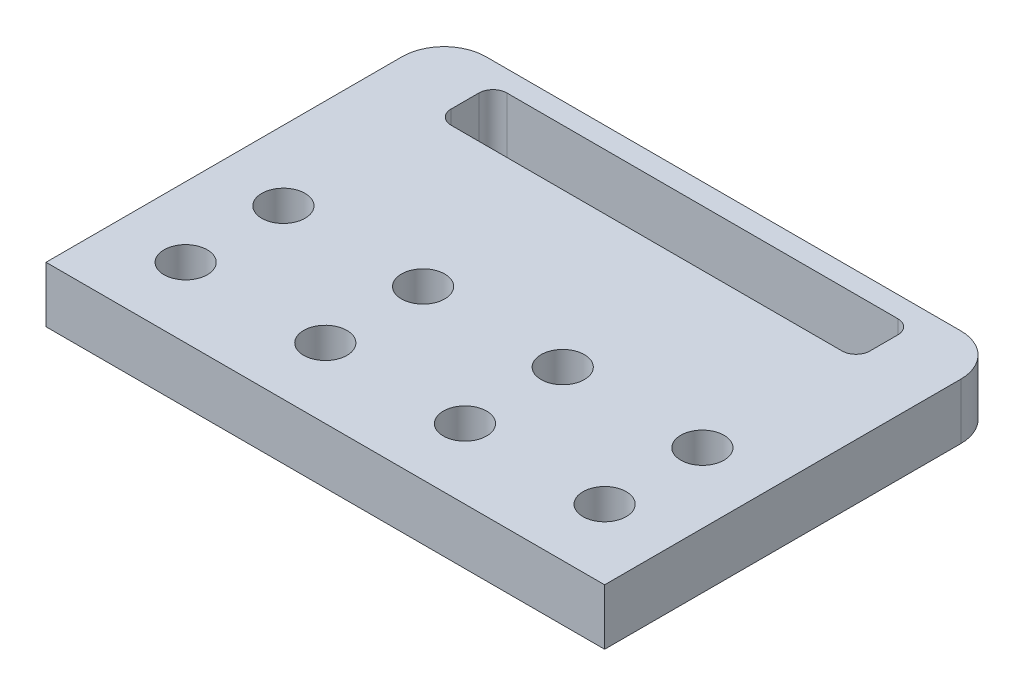
ISO-10303-21;
HEADER;
FILE_DESCRIPTION(('STEP AP214'),'2;1');
FILE_NAME('part.step','',(''),(''),'','','');
FILE_SCHEMA(('AUTOMOTIVE_DESIGN { 1 0 10303 214 1 1 1 1 }'));
ENDSEC;
DATA;
#1=APPLICATION_CONTEXT('core data for automotive mechanical design processes');
#2=APPLICATION_PROTOCOL_DEFINITION('international standard','automotive_design',2000,#1);
#3=PRODUCT_CONTEXT('',#1,'mechanical');
#4=PRODUCT('Part','Part','',(#3));
#5=PRODUCT_RELATED_PRODUCT_CATEGORY('part','',(#4));
#6=PRODUCT_DEFINITION_FORMATION('','',#4);
#7=PRODUCT_DEFINITION_CONTEXT('part definition',#1,'design');
#8=PRODUCT_DEFINITION('design','',#6,#7);
#9=PRODUCT_DEFINITION_SHAPE('','',#8);
#10=(LENGTH_UNIT() NAMED_UNIT(*) SI_UNIT(.MILLI.,.METRE.));
#11=(NAMED_UNIT(*) PLANE_ANGLE_UNIT() SI_UNIT($,.RADIAN.));
#12=(NAMED_UNIT(*) SI_UNIT($,.STERADIAN.) SOLID_ANGLE_UNIT());
#13=UNCERTAINTY_MEASURE_WITH_UNIT(LENGTH_MEASURE(1.E-05),#10,'distance_accuracy_value','');
#14=(GEOMETRIC_REPRESENTATION_CONTEXT(3) GLOBAL_UNCERTAINTY_ASSIGNED_CONTEXT((#13)) GLOBAL_UNIT_ASSIGNED_CONTEXT((#10,
#11,#12)) REPRESENTATION_CONTEXT('',''));
#15=CARTESIAN_POINT('',(0.,0.,0.));
#16=DIRECTION('',(0.,0.,1.));
#17=DIRECTION('',(1.,0.,0.));
#18=AXIS2_PLACEMENT_3D('',#15,#16,#17);
#19=CARTESIAN_POINT('',(0.,4.,0.));
#20=DIRECTION('',(0.,-1.,0.));
#21=DIRECTION('',(0.,0.,-1.));
#22=AXIS2_PLACEMENT_3D('',#19,#20,#21);
#23=PLANE('',#22);
#24=CARTESIAN_POINT('',(-15.,4.,2.25));
#25=DIRECTION('',(0.,1.,0.));
#26=DIRECTION('',(0.,0.,1.));
#27=AXIS2_PLACEMENT_3D('',#24,#25,#26);
#28=CIRCLE('',#27,1.55);
#29=CARTESIAN_POINT('',(-15.,4.,3.8));
#30=VERTEX_POINT('',#29);
#31=EDGE_CURVE('E598',#30,#30,#28,.T.);
#32=ORIENTED_EDGE('',*,*,#31,.F.);
#33=EDGE_LOOP('',(#32));
#34=FACE_BOUND('',#33,.T.);
#35=CARTESIAN_POINT('',(-5.,4.,2.25));
#36=DIRECTION('',(0.,1.,0.));
#37=DIRECTION('',(0.,0.,1.));
#38=AXIS2_PLACEMENT_3D('',#35,#36,#37);
#39=CIRCLE('',#38,1.55);
#40=CARTESIAN_POINT('',(-5.,4.,3.8));
#41=VERTEX_POINT('',#40);
#42=EDGE_CURVE('E599',#41,#41,#39,.T.);
#43=ORIENTED_EDGE('',*,*,#42,.F.);
#44=EDGE_LOOP('',(#43));
#45=FACE_BOUND('',#44,.T.);
#46=CARTESIAN_POINT('',(5.,4.,2.25));
#47=DIRECTION('',(0.,1.,0.));
#48=DIRECTION('',(0.,0.,1.));
#49=AXIS2_PLACEMENT_3D('',#46,#47,#48);
#50=CIRCLE('',#49,1.55);
#51=CARTESIAN_POINT('',(5.,4.,3.8));
#52=VERTEX_POINT('',#51);
#53=EDGE_CURVE('E609',#52,#52,#50,.T.);
#54=ORIENTED_EDGE('',*,*,#53,.F.);
#55=EDGE_LOOP('',(#54));
#56=FACE_BOUND('',#55,.T.);
#57=CARTESIAN_POINT('',(15.,4.,2.25));
#58=DIRECTION('',(0.,1.,0.));
#59=DIRECTION('',(0.,0.,1.));
#60=AXIS2_PLACEMENT_3D('',#57,#58,#59);
#61=CIRCLE('',#60,1.55);
#62=CARTESIAN_POINT('',(15.,4.,3.8));
#63=VERTEX_POINT('',#62);
#64=EDGE_CURVE('E615',#63,#63,#61,.T.);
#65=ORIENTED_EDGE('',*,*,#64,.F.);
#66=EDGE_LOOP('',(#65));
#67=FACE_BOUND('',#66,.T.);
#68=CARTESIAN_POINT('',(-15.,4.,9.25000000000001));
#69=DIRECTION('',(0.,1.,0.));
#70=DIRECTION('',(0.,0.,1.));
#71=AXIS2_PLACEMENT_3D('',#68,#69,#70);
#72=CIRCLE('',#71,1.55);
#73=CARTESIAN_POINT('',(-15.,4.,10.8));
#74=VERTEX_POINT('',#73);
#75=EDGE_CURVE('E623',#74,#74,#72,.T.);
#76=ORIENTED_EDGE('',*,*,#75,.F.);
#77=EDGE_LOOP('',(#76));
#78=FACE_BOUND('',#77,.T.);
#79=CARTESIAN_POINT('',(5.,4.,9.25000000000001));
#80=DIRECTION('',(0.,1.,0.));
#81=DIRECTION('',(0.,0.,1.));
#82=AXIS2_PLACEMENT_3D('',#79,#80,#81);
#83=CIRCLE('',#82,1.55);
#84=CARTESIAN_POINT('',(5.,4.,10.8));
#85=VERTEX_POINT('',#84);
#86=EDGE_CURVE('E626',#85,#85,#83,.T.);
#87=ORIENTED_EDGE('',*,*,#86,.F.);
#88=EDGE_LOOP('',(#87));
#89=FACE_BOUND('',#88,.T.);
#90=CARTESIAN_POINT('',(15.,4.,9.25000000000001));
#91=DIRECTION('',(0.,1.,0.));
#92=DIRECTION('',(0.,0.,-1.));
#93=AXIS2_PLACEMENT_3D('',#90,#91,#92);
#94=CIRCLE('',#93,1.55);
#95=CARTESIAN_POINT('',(15.,4.,7.70000000000001));
#96=VERTEX_POINT('',#95);
#97=EDGE_CURVE('E632',#96,#96,#94,.T.);
#98=ORIENTED_EDGE('',*,*,#97,.F.);
#99=EDGE_LOOP('',(#98));
#100=FACE_BOUND('',#99,.T.);
#101=CARTESIAN_POINT('',(-5.,4.,9.25000000000001));
#102=DIRECTION('',(0.,1.,0.));
#103=DIRECTION('',(0.,0.,-1.));
#104=AXIS2_PLACEMENT_3D('',#101,#102,#103);
#105=CIRCLE('',#104,1.55000000000001);
#106=CARTESIAN_POINT('',(-5.,4.,7.7));
#107=VERTEX_POINT('',#106);
#108=EDGE_CURVE('E638',#107,#107,#105,.T.);
#109=ORIENTED_EDGE('',*,*,#108,.F.);
#110=EDGE_LOOP('',(#109));
#111=FACE_BOUND('',#110,.T.);
#112=DIRECTION('',(0.,0.,-1.));
#113=VECTOR('',#112,1.);
#114=CARTESIAN_POINT('',(20.,4.,14.25));
#115=LINE('',#114,#113);
#116=CARTESIAN_POINT('',(20.,4.,14.25));
#117=VERTEX_POINT('',#116);
#118=CARTESIAN_POINT('',(20.,4.,-11.25));
#119=VERTEX_POINT('',#118);
#120=EDGE_CURVE('E218',#117,#119,#115,.T.);
#121=ORIENTED_EDGE('',*,*,#120,.T.);
#122=CARTESIAN_POINT('',(17.,4.,-11.25));
#123=DIRECTION('',(0.,-1.,0.));
#124=DIRECTION('',(0.,0.,-1.));
#125=AXIS2_PLACEMENT_3D('',#122,#123,#124);
#126=CIRCLE('',#125,3.);
#127=CARTESIAN_POINT('',(17.,4.,-14.25));
#128=VERTEX_POINT('',#127);
#129=EDGE_CURVE('E49',#119,#128,#126,.F.);
#130=ORIENTED_EDGE('',*,*,#129,.T.);
#131=DIRECTION('',(-1.,0.,0.));
#132=VECTOR('',#131,1.);
#133=CARTESIAN_POINT('',(-20.,4.,-14.25));
#134=LINE('',#133,#132);
#135=CARTESIAN_POINT('',(-17.,4.,-14.25));
#136=VERTEX_POINT('',#135);
#137=EDGE_CURVE('E220',#128,#136,#134,.T.);
#138=ORIENTED_EDGE('',*,*,#137,.T.);
#139=CARTESIAN_POINT('',(-17.,4.,-11.25));
#140=DIRECTION('',(0.,-1.,0.));
#141=DIRECTION('',(0.,0.,-1.));
#142=AXIS2_PLACEMENT_3D('',#139,#140,#141);
#143=CIRCLE('',#142,3.);
#144=CARTESIAN_POINT('',(-20.,4.,-11.25));
#145=VERTEX_POINT('',#144);
#146=EDGE_CURVE('E56',#136,#145,#143,.F.);
#147=ORIENTED_EDGE('',*,*,#146,.T.);
#148=DIRECTION('',(0.,0.,1.));
#149=VECTOR('',#148,1.);
#150=CARTESIAN_POINT('',(-20.,4.,14.25));
#151=LINE('',#150,#149);
#152=CARTESIAN_POINT('',(-20.,4.,14.25));
#153=VERTEX_POINT('',#152);
#154=EDGE_CURVE('E223',#145,#153,#151,.T.);
#155=ORIENTED_EDGE('',*,*,#154,.T.);
#156=DIRECTION('',(1.,0.,0.));
#157=VECTOR('',#156,1.);
#158=CARTESIAN_POINT('',(-20.,4.,14.25));
#159=LINE('',#158,#157);
#160=EDGE_CURVE('E225',#153,#117,#159,.T.);
#161=ORIENTED_EDGE('',*,*,#160,.T.);
#162=EDGE_LOOP('',(#121,#130,#138,#147,#155,#161));
#163=FACE_BOUND('',#162,.T.);
#164=CARTESIAN_POINT('',(14.,4.,-11.75));
#165=DIRECTION('',(0.,1.,0.));
#166=DIRECTION('',(0.,0.,-1.));
#167=AXIS2_PLACEMENT_3D('',#164,#165,#166);
#168=CIRCLE('',#167,0.999999999999999);
#169=CARTESIAN_POINT('',(15.,4.,-11.75));
#170=VERTEX_POINT('',#169);
#171=CARTESIAN_POINT('',(14.,4.,-12.75));
#172=VERTEX_POINT('',#171);
#173=EDGE_CURVE('E146',#170,#172,#168,.T.);
#174=ORIENTED_EDGE('',*,*,#173,.F.);
#175=DIRECTION('',(0.,0.,-1.));
#176=VECTOR('',#175,1.);
#177=CARTESIAN_POINT('',(15.,4.,-11.75));
#178=LINE('',#177,#176);
#179=CARTESIAN_POINT('',(15.,4.,-9.74999999999999));
#180=VERTEX_POINT('',#179);
#181=EDGE_CURVE('E183',#180,#170,#178,.T.);
#182=ORIENTED_EDGE('',*,*,#181,.F.);
#183=CARTESIAN_POINT('',(14.,4.,-9.74999999999999));
#184=DIRECTION('',(0.,1.,0.));
#185=DIRECTION('',(0.,0.,1.));
#186=AXIS2_PLACEMENT_3D('',#183,#184,#185);
#187=CIRCLE('',#186,0.999999999999999);
#188=CARTESIAN_POINT('',(14.,4.,-8.74999999999999));
#189=VERTEX_POINT('',#188);
#190=EDGE_CURVE('E180',#189,#180,#187,.T.);
#191=ORIENTED_EDGE('',*,*,#190,.F.);
#192=DIRECTION('',(1.,0.,0.));
#193=VECTOR('',#192,1.);
#194=CARTESIAN_POINT('',(-14.,4.,-8.74999999999999));
#195=LINE('',#194,#193);
#196=CARTESIAN_POINT('',(-14.,4.,-8.75));
#197=VERTEX_POINT('',#196);
#198=EDGE_CURVE('E178',#197,#189,#195,.T.);
#199=ORIENTED_EDGE('',*,*,#198,.F.);
#200=CARTESIAN_POINT('',(-14.,4.,-9.74999999999999));
#201=DIRECTION('',(0.,1.,0.));
#202=DIRECTION('',(0.,0.,1.));
#203=AXIS2_PLACEMENT_3D('',#200,#201,#202);
#204=CIRCLE('',#203,0.999999999999999);
#205=CARTESIAN_POINT('',(-15.,4.,-9.74999999999999));
#206=VERTEX_POINT('',#205);
#207=EDGE_CURVE('E176',#206,#197,#204,.T.);
#208=ORIENTED_EDGE('',*,*,#207,.F.);
#209=DIRECTION('',(0.,0.,1.));
#210=VECTOR('',#209,1.);
#211=CARTESIAN_POINT('',(-15.,4.,-11.75));
#212=LINE('',#211,#210);
#213=CARTESIAN_POINT('',(-15.,4.,-11.75));
#214=VERTEX_POINT('',#213);
#215=EDGE_CURVE('E171',#214,#206,#212,.T.);
#216=ORIENTED_EDGE('',*,*,#215,.F.);
#217=CARTESIAN_POINT('',(-14.,4.,-11.75));
#218=DIRECTION('',(0.,1.,0.));
#219=DIRECTION('',(0.,0.,1.));
#220=AXIS2_PLACEMENT_3D('',#217,#218,#219);
#221=CIRCLE('',#220,0.999999999999999);
#222=CARTESIAN_POINT('',(-14.,4.,-12.75));
#223=VERTEX_POINT('',#222);
#224=EDGE_CURVE('E169',#223,#214,#221,.T.);
#225=ORIENTED_EDGE('',*,*,#224,.F.);
#226=DIRECTION('',(-1.,0.,0.));
#227=VECTOR('',#226,1.);
#228=CARTESIAN_POINT('',(-14.,4.,-12.75));
#229=LINE('',#228,#227);
#230=EDGE_CURVE('E156',#172,#223,#229,.T.);
#231=ORIENTED_EDGE('',*,*,#230,.F.);
#232=EDGE_LOOP('',(#174,#182,#191,#199,#208,#216,#225,#231));
#233=FACE_BOUND('',#232,.T.);
#234=ADVANCED_FACE('F41',(#34,#45,#56,#67,#78,#89,#100,#111,#163,#233),#23,.F.);
#235=CARTESIAN_POINT('',(0.,0.,0.));
#236=DIRECTION('',(0.,-1.,0.));
#237=DIRECTION('',(0.,0.,-1.));
#238=AXIS2_PLACEMENT_3D('',#235,#236,#237);
#239=PLANE('',#238);
#240=CARTESIAN_POINT('',(-15.,0.,2.25));
#241=DIRECTION('',(0.,1.,0.));
#242=DIRECTION('',(0.,0.,1.));
#243=AXIS2_PLACEMENT_3D('',#240,#241,#242);
#244=CIRCLE('',#243,1.55);
#245=CARTESIAN_POINT('',(-15.,0.,3.8));
#246=VERTEX_POINT('',#245);
#247=EDGE_CURVE('E596',#246,#246,#244,.T.);
#248=ORIENTED_EDGE('',*,*,#247,.T.);
#249=EDGE_LOOP('',(#248));
#250=FACE_BOUND('',#249,.T.);
#251=CARTESIAN_POINT('',(-5.,0.,2.25));
#252=DIRECTION('',(0.,1.,0.));
#253=DIRECTION('',(0.,0.,1.));
#254=AXIS2_PLACEMENT_3D('',#251,#252,#253);
#255=CIRCLE('',#254,1.55);
#256=CARTESIAN_POINT('',(-5.,0.,3.8));
#257=VERTEX_POINT('',#256);
#258=EDGE_CURVE('E604',#257,#257,#255,.T.);
#259=ORIENTED_EDGE('',*,*,#258,.T.);
#260=EDGE_LOOP('',(#259));
#261=FACE_BOUND('',#260,.T.);
#262=CARTESIAN_POINT('',(5.,0.,2.25));
#263=DIRECTION('',(0.,1.,0.));
#264=DIRECTION('',(0.,0.,1.));
#265=AXIS2_PLACEMENT_3D('',#262,#263,#264);
#266=CIRCLE('',#265,1.55);
#267=CARTESIAN_POINT('',(5.,0.,3.8));
#268=VERTEX_POINT('',#267);
#269=EDGE_CURVE('E612',#268,#268,#266,.T.);
#270=ORIENTED_EDGE('',*,*,#269,.T.);
#271=EDGE_LOOP('',(#270));
#272=FACE_BOUND('',#271,.T.);
#273=CARTESIAN_POINT('',(15.,0.,2.25));
#274=DIRECTION('',(0.,1.,0.));
#275=DIRECTION('',(0.,0.,1.));
#276=AXIS2_PLACEMENT_3D('',#273,#274,#275);
#277=CIRCLE('',#276,1.55);
#278=CARTESIAN_POINT('',(15.,0.,3.8));
#279=VERTEX_POINT('',#278);
#280=EDGE_CURVE('E618',#279,#279,#277,.T.);
#281=ORIENTED_EDGE('',*,*,#280,.T.);
#282=EDGE_LOOP('',(#281));
#283=FACE_BOUND('',#282,.T.);
#284=CARTESIAN_POINT('',(-15.,0.,9.25000000000001));
#285=DIRECTION('',(0.,1.,0.));
#286=DIRECTION('',(0.,0.,1.));
#287=AXIS2_PLACEMENT_3D('',#284,#285,#286);
#288=CIRCLE('',#287,1.55);
#289=CARTESIAN_POINT('',(-15.,0.,10.8));
#290=VERTEX_POINT('',#289);
#291=EDGE_CURVE('E187',#290,#290,#288,.T.);
#292=ORIENTED_EDGE('',*,*,#291,.T.);
#293=EDGE_LOOP('',(#292));
#294=FACE_BOUND('',#293,.T.);
#295=CARTESIAN_POINT('',(5.,0.,9.25000000000001));
#296=DIRECTION('',(0.,1.,0.));
#297=DIRECTION('',(0.,0.,1.));
#298=AXIS2_PLACEMENT_3D('',#295,#296,#297);
#299=CIRCLE('',#298,1.55);
#300=CARTESIAN_POINT('',(5.,0.,10.8));
#301=VERTEX_POINT('',#300);
#302=EDGE_CURVE('E629',#301,#301,#299,.T.);
#303=ORIENTED_EDGE('',*,*,#302,.T.);
#304=EDGE_LOOP('',(#303));
#305=FACE_BOUND('',#304,.T.);
#306=CARTESIAN_POINT('',(15.,0.,9.25000000000001));
#307=DIRECTION('',(0.,1.,0.));
#308=DIRECTION('',(0.,0.,-1.));
#309=AXIS2_PLACEMENT_3D('',#306,#307,#308);
#310=CIRCLE('',#309,1.55);
#311=CARTESIAN_POINT('',(15.,0.,7.70000000000001));
#312=VERTEX_POINT('',#311);
#313=EDGE_CURVE('E635',#312,#312,#310,.T.);
#314=ORIENTED_EDGE('',*,*,#313,.T.);
#315=EDGE_LOOP('',(#314));
#316=FACE_BOUND('',#315,.T.);
#317=CARTESIAN_POINT('',(-5.,0.,9.25000000000001));
#318=DIRECTION('',(0.,1.,0.));
#319=DIRECTION('',(0.,0.,-1.));
#320=AXIS2_PLACEMENT_3D('',#317,#318,#319);
#321=CIRCLE('',#320,1.55000000000001);
#322=CARTESIAN_POINT('',(-5.,0.,7.7));
#323=VERTEX_POINT('',#322);
#324=EDGE_CURVE('E601',#323,#323,#321,.T.);
#325=ORIENTED_EDGE('',*,*,#324,.T.);
#326=EDGE_LOOP('',(#325));
#327=FACE_BOUND('',#326,.T.);
#328=DIRECTION('',(-1.,0.,0.));
#329=VECTOR('',#328,1.);
#330=CARTESIAN_POINT('',(-20.,0.,-14.25));
#331=LINE('',#330,#329);
#332=CARTESIAN_POINT('',(17.,0.,-14.25));
#333=VERTEX_POINT('',#332);
#334=CARTESIAN_POINT('',(-17.,0.,-14.25));
#335=VERTEX_POINT('',#334);
#336=EDGE_CURVE('E229',#333,#335,#331,.T.);
#337=ORIENTED_EDGE('',*,*,#336,.F.);
#338=CARTESIAN_POINT('',(17.,0.,-11.25));
#339=DIRECTION('',(0.,-1.,0.));
#340=DIRECTION('',(0.,0.,-1.));
#341=AXIS2_PLACEMENT_3D('',#338,#339,#340);
#342=CIRCLE('',#341,3.);
#343=CARTESIAN_POINT('',(20.,0.,-11.25));
#344=VERTEX_POINT('',#343);
#345=EDGE_CURVE('E247',#333,#344,#342,.T.);
#346=ORIENTED_EDGE('',*,*,#345,.T.);
#347=DIRECTION('',(0.,0.,-1.));
#348=VECTOR('',#347,1.);
#349=CARTESIAN_POINT('',(20.,0.,14.25));
#350=LINE('',#349,#348);
#351=CARTESIAN_POINT('',(20.,0.,14.25));
#352=VERTEX_POINT('',#351);
#353=EDGE_CURVE('E164',#352,#344,#350,.T.);
#354=ORIENTED_EDGE('',*,*,#353,.F.);
#355=DIRECTION('',(1.,0.,0.));
#356=VECTOR('',#355,1.);
#357=CARTESIAN_POINT('',(-20.,0.,14.25));
#358=LINE('',#357,#356);
#359=CARTESIAN_POINT('',(-20.,0.,14.25));
#360=VERTEX_POINT('',#359);
#361=EDGE_CURVE('E221',#360,#352,#358,.T.);
#362=ORIENTED_EDGE('',*,*,#361,.F.);
#363=DIRECTION('',(0.,0.,1.));
#364=VECTOR('',#363,1.);
#365=CARTESIAN_POINT('',(-20.,0.,14.25));
#366=LINE('',#365,#364);
#367=CARTESIAN_POINT('',(-20.,0.,-11.25));
#368=VERTEX_POINT('',#367);
#369=EDGE_CURVE('E232',#368,#360,#366,.T.);
#370=ORIENTED_EDGE('',*,*,#369,.F.);
#371=CARTESIAN_POINT('',(-17.,0.,-11.25));
#372=DIRECTION('',(0.,-1.,0.));
#373=DIRECTION('',(0.,0.,-1.));
#374=AXIS2_PLACEMENT_3D('',#371,#372,#373);
#375=CIRCLE('',#374,3.);
#376=EDGE_CURVE('E245',#368,#335,#375,.T.);
#377=ORIENTED_EDGE('',*,*,#376,.T.);
#378=EDGE_LOOP('',(#337,#346,#354,#362,#370,#377));
#379=FACE_BOUND('',#378,.T.);
#380=DIRECTION('',(0.,0.,-1.));
#381=VECTOR('',#380,1.);
#382=CARTESIAN_POINT('',(15.,0.,-11.75));
#383=LINE('',#382,#381);
#384=CARTESIAN_POINT('',(15.,0.,-9.74999999999999));
#385=VERTEX_POINT('',#384);
#386=CARTESIAN_POINT('',(15.,0.,-11.75));
#387=VERTEX_POINT('',#386);
#388=EDGE_CURVE('E157',#385,#387,#383,.T.);
#389=ORIENTED_EDGE('',*,*,#388,.T.);
#390=CARTESIAN_POINT('',(14.,0.,-11.75));
#391=DIRECTION('',(0.,1.,0.));
#392=DIRECTION('',(0.,0.,-1.));
#393=AXIS2_PLACEMENT_3D('',#390,#391,#392);
#394=CIRCLE('',#393,0.999999999999999);
#395=CARTESIAN_POINT('',(14.,0.,-12.75));
#396=VERTEX_POINT('',#395);
#397=EDGE_CURVE('E185',#387,#396,#394,.T.);
#398=ORIENTED_EDGE('',*,*,#397,.T.);
#399=DIRECTION('',(-1.,0.,0.));
#400=VECTOR('',#399,1.);
#401=CARTESIAN_POINT('',(-14.,0.,-12.75));
#402=LINE('',#401,#400);
#403=CARTESIAN_POINT('',(-14.,0.,-12.75));
#404=VERTEX_POINT('',#403);
#405=EDGE_CURVE('E163',#396,#404,#402,.T.);
#406=ORIENTED_EDGE('',*,*,#405,.T.);
#407=CARTESIAN_POINT('',(-14.,0.,-11.75));
#408=DIRECTION('',(0.,1.,0.));
#409=DIRECTION('',(0.,0.,1.));
#410=AXIS2_PLACEMENT_3D('',#407,#408,#409);
#411=CIRCLE('',#410,0.999999999999999);
#412=CARTESIAN_POINT('',(-15.,0.,-11.75));
#413=VERTEX_POINT('',#412);
#414=EDGE_CURVE('E189',#404,#413,#411,.T.);
#415=ORIENTED_EDGE('',*,*,#414,.T.);
#416=DIRECTION('',(0.,0.,1.));
#417=VECTOR('',#416,1.);
#418=CARTESIAN_POINT('',(-15.,0.,-11.75));
#419=LINE('',#418,#417);
#420=CARTESIAN_POINT('',(-15.,0.,-9.74999999999999));
#421=VERTEX_POINT('',#420);
#422=EDGE_CURVE('E192',#413,#421,#419,.T.);
#423=ORIENTED_EDGE('',*,*,#422,.T.);
#424=CARTESIAN_POINT('',(-14.,0.,-9.74999999999999));
#425=DIRECTION('',(0.,1.,0.));
#426=DIRECTION('',(0.,0.,1.));
#427=AXIS2_PLACEMENT_3D('',#424,#425,#426);
#428=CIRCLE('',#427,0.999999999999999);
#429=CARTESIAN_POINT('',(-14.,0.,-8.75));
#430=VERTEX_POINT('',#429);
#431=EDGE_CURVE('E195',#421,#430,#428,.T.);
#432=ORIENTED_EDGE('',*,*,#431,.T.);
#433=DIRECTION('',(1.,0.,0.));
#434=VECTOR('',#433,1.);
#435=CARTESIAN_POINT('',(-14.,0.,-8.74999999999999));
#436=LINE('',#435,#434);
#437=CARTESIAN_POINT('',(14.,0.,-8.74999999999999));
#438=VERTEX_POINT('',#437);
#439=EDGE_CURVE('E198',#430,#438,#436,.T.);
#440=ORIENTED_EDGE('',*,*,#439,.T.);
#441=CARTESIAN_POINT('',(14.,0.,-9.74999999999999));
#442=DIRECTION('',(0.,1.,0.));
#443=DIRECTION('',(0.,0.,1.));
#444=AXIS2_PLACEMENT_3D('',#441,#442,#443);
#445=CIRCLE('',#444,0.999999999999999);
#446=EDGE_CURVE('E201',#438,#385,#445,.T.);
#447=ORIENTED_EDGE('',*,*,#446,.T.);
#448=EDGE_LOOP('',(#389,#398,#406,#415,#423,#432,#440,#447));
#449=FACE_BOUND('',#448,.T.);
#450=ADVANCED_FACE('F261',(#250,#261,#272,#283,#294,#305,#316,#327,#379,#449),#239,.T.);
#451=CARTESIAN_POINT('',(20.,4.,14.25));
#452=DIRECTION('',(-1.,0.,0.));
#453=DIRECTION('',(0.,0.,1.));
#454=AXIS2_PLACEMENT_3D('',#451,#452,#453);
#455=PLANE('',#454);
#456=ORIENTED_EDGE('',*,*,#353,.T.);
#457=DIRECTION('',(0.,-1.,0.));
#458=VECTOR('',#457,1.);
#459=CARTESIAN_POINT('',(20.,4.,-11.25));
#460=LINE('',#459,#458);
#461=EDGE_CURVE('E64',#344,#119,#460,.F.);
#462=ORIENTED_EDGE('',*,*,#461,.T.);
#463=ORIENTED_EDGE('',*,*,#120,.F.);
#464=DIRECTION('',(0.,-1.,0.));
#465=VECTOR('',#464,1.);
#466=CARTESIAN_POINT('',(20.,4.,14.25));
#467=LINE('',#466,#465);
#468=EDGE_CURVE('E227',#117,#352,#467,.T.);
#469=ORIENTED_EDGE('',*,*,#468,.T.);
#470=EDGE_LOOP('',(#456,#462,#463,#469));
#471=FACE_BOUND('',#470,.T.);
#472=ADVANCED_FACE('F264',(#471),#455,.F.);
#473=CARTESIAN_POINT('',(-20.,4.,-14.25));
#474=DIRECTION('',(0.,0.,1.));
#475=DIRECTION('',(1.,0.,0.));
#476=AXIS2_PLACEMENT_3D('',#473,#474,#475);
#477=PLANE('',#476);
#478=ORIENTED_EDGE('',*,*,#137,.F.);
#479=DIRECTION('',(0.,-1.,0.));
#480=VECTOR('',#479,1.);
#481=CARTESIAN_POINT('',(17.,4.,-14.25));
#482=LINE('',#481,#480);
#483=EDGE_CURVE('E242',#128,#333,#482,.T.);
#484=ORIENTED_EDGE('',*,*,#483,.T.);
#485=ORIENTED_EDGE('',*,*,#336,.T.);
#486=DIRECTION('',(0.,-1.,0.));
#487=VECTOR('',#486,1.);
#488=CARTESIAN_POINT('',(-17.,4.,-14.25));
#489=LINE('',#488,#487);
#490=EDGE_CURVE('E240',#335,#136,#489,.F.);
#491=ORIENTED_EDGE('',*,*,#490,.T.);
#492=EDGE_LOOP('',(#478,#484,#485,#491));
#493=FACE_BOUND('',#492,.T.);
#494=ADVANCED_FACE('F255',(#493),#477,.F.);
#495=CARTESIAN_POINT('',(-20.,4.,14.25));
#496=DIRECTION('',(1.,0.,0.));
#497=DIRECTION('',(0.,0.,-1.));
#498=AXIS2_PLACEMENT_3D('',#495,#496,#497);
#499=PLANE('',#498);
#500=ORIENTED_EDGE('',*,*,#154,.F.);
#501=DIRECTION('',(0.,-1.,0.));
#502=VECTOR('',#501,1.);
#503=CARTESIAN_POINT('',(-20.,4.,-11.25));
#504=LINE('',#503,#502);
#505=EDGE_CURVE('E11',#145,#368,#504,.T.);
#506=ORIENTED_EDGE('',*,*,#505,.T.);
#507=ORIENTED_EDGE('',*,*,#369,.T.);
#508=DIRECTION('',(0.,-1.,0.));
#509=VECTOR('',#508,1.);
#510=CARTESIAN_POINT('',(-20.,4.,14.25));
#511=LINE('',#510,#509);
#512=EDGE_CURVE('E237',#153,#360,#511,.T.);
#513=ORIENTED_EDGE('',*,*,#512,.F.);
#514=EDGE_LOOP('',(#500,#506,#507,#513));
#515=FACE_BOUND('',#514,.T.);
#516=ADVANCED_FACE('F272',(#515),#499,.F.);
#517=CARTESIAN_POINT('',(-20.,4.,14.25));
#518=DIRECTION('',(0.,0.,-1.));
#519=DIRECTION('',(-1.,0.,0.));
#520=AXIS2_PLACEMENT_3D('',#517,#518,#519);
#521=PLANE('',#520);
#522=ORIENTED_EDGE('',*,*,#361,.T.);
#523=ORIENTED_EDGE('',*,*,#468,.F.);
#524=ORIENTED_EDGE('',*,*,#160,.F.);
#525=ORIENTED_EDGE('',*,*,#512,.T.);
#526=EDGE_LOOP('',(#522,#523,#524,#525));
#527=FACE_BOUND('',#526,.T.);
#528=ADVANCED_FACE('F268',(#527),#521,.F.);
#529=CARTESIAN_POINT('',(14.,4.,-11.75));
#530=DIRECTION('',(0.,-1.,0.));
#531=DIRECTION('',(0.,0.,-1.));
#532=AXIS2_PLACEMENT_3D('',#529,#530,#531);
#533=CYLINDRICAL_SURFACE('',#532,0.999999999999999);
#534=ORIENTED_EDGE('',*,*,#397,.F.);
#535=DIRECTION('',(0.,-1.,0.));
#536=VECTOR('',#535,1.);
#537=CARTESIAN_POINT('',(15.,4.,-11.75));
#538=LINE('',#537,#536);
#539=EDGE_CURVE('E152',#170,#387,#538,.T.);
#540=ORIENTED_EDGE('',*,*,#539,.F.);
#541=ORIENTED_EDGE('',*,*,#173,.T.);
#542=DIRECTION('',(0.,-1.,0.));
#543=VECTOR('',#542,1.);
#544=CARTESIAN_POINT('',(14.,4.,-12.75));
#545=LINE('',#544,#543);
#546=EDGE_CURVE('E149',#172,#396,#545,.T.);
#547=ORIENTED_EDGE('',*,*,#546,.T.);
#548=EDGE_LOOP('',(#534,#540,#541,#547));
#549=FACE_BOUND('',#548,.T.);
#550=ADVANCED_FACE('F148',(#549),#533,.F.);
#551=CARTESIAN_POINT('',(-14.,4.,-12.75));
#552=DIRECTION('',(0.,0.,1.));
#553=DIRECTION('',(1.,0.,0.));
#554=AXIS2_PLACEMENT_3D('',#551,#552,#553);
#555=PLANE('',#554);
#556=ORIENTED_EDGE('',*,*,#405,.F.);
#557=ORIENTED_EDGE('',*,*,#546,.F.);
#558=ORIENTED_EDGE('',*,*,#230,.T.);
#559=DIRECTION('',(0.,-1.,0.));
#560=VECTOR('',#559,1.);
#561=CARTESIAN_POINT('',(-14.,4.,-12.75));
#562=LINE('',#561,#560);
#563=EDGE_CURVE('E165',#223,#404,#562,.T.);
#564=ORIENTED_EDGE('',*,*,#563,.T.);
#565=EDGE_LOOP('',(#556,#557,#558,#564));
#566=FACE_BOUND('',#565,.T.);
#567=ADVANCED_FACE('F160',(#566),#555,.T.);
#568=CARTESIAN_POINT('',(-14.,4.,-11.75));
#569=DIRECTION('',(0.,-1.,0.));
#570=DIRECTION('',(0.,0.,-1.));
#571=AXIS2_PLACEMENT_3D('',#568,#569,#570);
#572=CYLINDRICAL_SURFACE('',#571,0.999999999999999);
#573=ORIENTED_EDGE('',*,*,#414,.F.);
#574=ORIENTED_EDGE('',*,*,#563,.F.);
#575=ORIENTED_EDGE('',*,*,#224,.T.);
#576=DIRECTION('',(0.,-1.,0.));
#577=VECTOR('',#576,1.);
#578=CARTESIAN_POINT('',(-15.,4.,-11.75));
#579=LINE('',#578,#577);
#580=EDGE_CURVE('E215',#214,#413,#579,.T.);
#581=ORIENTED_EDGE('',*,*,#580,.T.);
#582=EDGE_LOOP('',(#573,#574,#575,#581));
#583=FACE_BOUND('',#582,.T.);
#584=ADVANCED_FACE('F327',(#583),#572,.F.);
#585=CARTESIAN_POINT('',(-15.,4.,-11.75));
#586=DIRECTION('',(1.,0.,0.));
#587=DIRECTION('',(0.,0.,-1.));
#588=AXIS2_PLACEMENT_3D('',#585,#586,#587);
#589=PLANE('',#588);
#590=ORIENTED_EDGE('',*,*,#422,.F.);
#591=ORIENTED_EDGE('',*,*,#580,.F.);
#592=ORIENTED_EDGE('',*,*,#215,.T.);
#593=DIRECTION('',(0.,-1.,0.));
#594=VECTOR('',#593,1.);
#595=CARTESIAN_POINT('',(-15.,4.,-9.74999999999999));
#596=LINE('',#595,#594);
#597=EDGE_CURVE('E213',#206,#421,#596,.T.);
#598=ORIENTED_EDGE('',*,*,#597,.T.);
#599=EDGE_LOOP('',(#590,#591,#592,#598));
#600=FACE_BOUND('',#599,.T.);
#601=ADVANCED_FACE('F333',(#600),#589,.T.);
#602=CARTESIAN_POINT('',(-14.,4.,-9.74999999999999));
#603=DIRECTION('',(0.,-1.,0.));
#604=DIRECTION('',(0.,0.,-1.));
#605=AXIS2_PLACEMENT_3D('',#602,#603,#604);
#606=CYLINDRICAL_SURFACE('',#605,0.999999999999999);
#607=ORIENTED_EDGE('',*,*,#431,.F.);
#608=ORIENTED_EDGE('',*,*,#597,.F.);
#609=ORIENTED_EDGE('',*,*,#207,.T.);
#610=DIRECTION('',(0.,-1.,0.));
#611=VECTOR('',#610,1.);
#612=CARTESIAN_POINT('',(-14.,4.,-8.75));
#613=LINE('',#612,#611);
#614=EDGE_CURVE('E211',#197,#430,#613,.T.);
#615=ORIENTED_EDGE('',*,*,#614,.T.);
#616=EDGE_LOOP('',(#607,#608,#609,#615));
#617=FACE_BOUND('',#616,.T.);
#618=ADVANCED_FACE('F341',(#617),#606,.F.);
#619=CARTESIAN_POINT('',(-14.,4.,-8.74999999999999));
#620=DIRECTION('',(0.,0.,-1.));
#621=DIRECTION('',(-1.,0.,0.));
#622=AXIS2_PLACEMENT_3D('',#619,#620,#621);
#623=PLANE('',#622);
#624=ORIENTED_EDGE('',*,*,#439,.F.);
#625=ORIENTED_EDGE('',*,*,#614,.F.);
#626=ORIENTED_EDGE('',*,*,#198,.T.);
#627=DIRECTION('',(0.,-1.,0.));
#628=VECTOR('',#627,1.);
#629=CARTESIAN_POINT('',(14.,4.,-8.74999999999999));
#630=LINE('',#629,#628);
#631=EDGE_CURVE('E209',#189,#438,#630,.T.);
#632=ORIENTED_EDGE('',*,*,#631,.T.);
#633=EDGE_LOOP('',(#624,#625,#626,#632));
#634=FACE_BOUND('',#633,.T.);
#635=ADVANCED_FACE('F349',(#634),#623,.T.);
#636=CARTESIAN_POINT('',(14.,4.,-9.74999999999999));
#637=DIRECTION('',(0.,-1.,0.));
#638=DIRECTION('',(0.,0.,-1.));
#639=AXIS2_PLACEMENT_3D('',#636,#637,#638);
#640=CYLINDRICAL_SURFACE('',#639,0.999999999999999);
#641=ORIENTED_EDGE('',*,*,#446,.F.);
#642=ORIENTED_EDGE('',*,*,#631,.F.);
#643=ORIENTED_EDGE('',*,*,#190,.T.);
#644=DIRECTION('',(0.,-1.,0.));
#645=VECTOR('',#644,1.);
#646=CARTESIAN_POINT('',(15.,4.,-9.74999999999999));
#647=LINE('',#646,#645);
#648=EDGE_CURVE('E207',#180,#385,#647,.T.);
#649=ORIENTED_EDGE('',*,*,#648,.T.);
#650=EDGE_LOOP('',(#641,#642,#643,#649));
#651=FACE_BOUND('',#650,.T.);
#652=ADVANCED_FACE('F357',(#651),#640,.F.);
#653=CARTESIAN_POINT('',(15.,4.,-11.75));
#654=DIRECTION('',(-1.,0.,0.));
#655=DIRECTION('',(0.,0.,1.));
#656=AXIS2_PLACEMENT_3D('',#653,#654,#655);
#657=PLANE('',#656);
#658=ORIENTED_EDGE('',*,*,#388,.F.);
#659=ORIENTED_EDGE('',*,*,#648,.F.);
#660=ORIENTED_EDGE('',*,*,#181,.T.);
#661=ORIENTED_EDGE('',*,*,#539,.T.);
#662=EDGE_LOOP('',(#658,#659,#660,#661));
#663=FACE_BOUND('',#662,.T.);
#664=ADVANCED_FACE('F365',(#663),#657,.T.);
#665=CARTESIAN_POINT('',(-5.,0.,9.25000000000001));
#666=DIRECTION('',(0.,1.,0.));
#667=DIRECTION('',(0.,0.,1.));
#668=AXIS2_PLACEMENT_3D('',#665,#666,#667);
#669=CYLINDRICAL_SURFACE('',#668,1.55000000000001);
#670=ORIENTED_EDGE('',*,*,#324,.F.);
#671=EDGE_LOOP('',(#670));
#672=FACE_BOUND('',#671,.T.);
#673=ORIENTED_EDGE('',*,*,#108,.T.);
#674=EDGE_LOOP('',(#673));
#675=FACE_BOUND('',#674,.T.);
#676=ADVANCED_FACE('F373',(#672,#675),#669,.F.);
#677=CARTESIAN_POINT('',(15.,0.,9.25000000000001));
#678=DIRECTION('',(0.,1.,0.));
#679=DIRECTION('',(0.,0.,1.));
#680=AXIS2_PLACEMENT_3D('',#677,#678,#679);
#681=CYLINDRICAL_SURFACE('',#680,1.55);
#682=ORIENTED_EDGE('',*,*,#313,.F.);
#683=EDGE_LOOP('',(#682));
#684=FACE_BOUND('',#683,.T.);
#685=ORIENTED_EDGE('',*,*,#97,.T.);
#686=EDGE_LOOP('',(#685));
#687=FACE_BOUND('',#686,.T.);
#688=ADVANCED_FACE('F381',(#684,#687),#681,.F.);
#689=CARTESIAN_POINT('',(5.,0.,9.25000000000001));
#690=DIRECTION('',(0.,1.,0.));
#691=DIRECTION('',(0.,0.,1.));
#692=AXIS2_PLACEMENT_3D('',#689,#690,#691);
#693=CYLINDRICAL_SURFACE('',#692,1.55);
#694=ORIENTED_EDGE('',*,*,#302,.F.);
#695=EDGE_LOOP('',(#694));
#696=FACE_BOUND('',#695,.T.);
#697=ORIENTED_EDGE('',*,*,#86,.T.);
#698=EDGE_LOOP('',(#697));
#699=FACE_BOUND('',#698,.T.);
#700=ADVANCED_FACE('F389',(#696,#699),#693,.F.);
#701=CARTESIAN_POINT('',(-15.,0.,9.25000000000001));
#702=DIRECTION('',(0.,1.,0.));
#703=DIRECTION('',(0.,0.,1.));
#704=AXIS2_PLACEMENT_3D('',#701,#702,#703);
#705=CYLINDRICAL_SURFACE('',#704,1.55);
#706=ORIENTED_EDGE('',*,*,#291,.F.);
#707=EDGE_LOOP('',(#706));
#708=FACE_BOUND('',#707,.T.);
#709=ORIENTED_EDGE('',*,*,#75,.T.);
#710=EDGE_LOOP('',(#709));
#711=FACE_BOUND('',#710,.T.);
#712=ADVANCED_FACE('F397',(#708,#711),#705,.F.);
#713=CARTESIAN_POINT('',(15.,0.,2.25));
#714=DIRECTION('',(0.,1.,0.));
#715=DIRECTION('',(0.,0.,1.));
#716=AXIS2_PLACEMENT_3D('',#713,#714,#715);
#717=CYLINDRICAL_SURFACE('',#716,1.55);
#718=ORIENTED_EDGE('',*,*,#280,.F.);
#719=EDGE_LOOP('',(#718));
#720=FACE_BOUND('',#719,.T.);
#721=ORIENTED_EDGE('',*,*,#64,.T.);
#722=EDGE_LOOP('',(#721));
#723=FACE_BOUND('',#722,.T.);
#724=ADVANCED_FACE('F405',(#720,#723),#717,.F.);
#725=CARTESIAN_POINT('',(5.,0.,2.25));
#726=DIRECTION('',(0.,1.,0.));
#727=DIRECTION('',(0.,0.,1.));
#728=AXIS2_PLACEMENT_3D('',#725,#726,#727);
#729=CYLINDRICAL_SURFACE('',#728,1.55);
#730=ORIENTED_EDGE('',*,*,#269,.F.);
#731=EDGE_LOOP('',(#730));
#732=FACE_BOUND('',#731,.T.);
#733=ORIENTED_EDGE('',*,*,#53,.T.);
#734=EDGE_LOOP('',(#733));
#735=FACE_BOUND('',#734,.T.);
#736=ADVANCED_FACE('F413',(#732,#735),#729,.F.);
#737=CARTESIAN_POINT('',(-5.,0.,2.25));
#738=DIRECTION('',(0.,1.,0.));
#739=DIRECTION('',(0.,0.,1.));
#740=AXIS2_PLACEMENT_3D('',#737,#738,#739);
#741=CYLINDRICAL_SURFACE('',#740,1.55);
#742=ORIENTED_EDGE('',*,*,#258,.F.);
#743=EDGE_LOOP('',(#742));
#744=FACE_BOUND('',#743,.T.);
#745=ORIENTED_EDGE('',*,*,#42,.T.);
#746=EDGE_LOOP('',(#745));
#747=FACE_BOUND('',#746,.T.);
#748=ADVANCED_FACE('F421',(#744,#747),#741,.F.);
#749=CARTESIAN_POINT('',(-15.,0.,2.25));
#750=DIRECTION('',(0.,1.,0.));
#751=DIRECTION('',(0.,0.,1.));
#752=AXIS2_PLACEMENT_3D('',#749,#750,#751);
#753=CYLINDRICAL_SURFACE('',#752,1.55);
#754=ORIENTED_EDGE('',*,*,#247,.F.);
#755=EDGE_LOOP('',(#754));
#756=FACE_BOUND('',#755,.T.);
#757=ORIENTED_EDGE('',*,*,#31,.T.);
#758=EDGE_LOOP('',(#757));
#759=FACE_BOUND('',#758,.T.);
#760=ADVANCED_FACE('F279',(#756,#759),#753,.F.);
#761=CARTESIAN_POINT('',(17.,4.,-11.25));
#762=DIRECTION('',(0.,-1.,0.));
#763=DIRECTION('',(0.,0.,-1.));
#764=AXIS2_PLACEMENT_3D('',#761,#762,#763);
#765=CYLINDRICAL_SURFACE('',#764,3.);
#766=ORIENTED_EDGE('',*,*,#129,.F.);
#767=ORIENTED_EDGE('',*,*,#461,.F.);
#768=ORIENTED_EDGE('',*,*,#345,.F.);
#769=ORIENTED_EDGE('',*,*,#483,.F.);
#770=EDGE_LOOP('',(#766,#767,#768,#769));
#771=FACE_BOUND('',#770,.T.);
#772=ADVANCED_FACE('F258',(#771),#765,.T.);
#773=CARTESIAN_POINT('',(-17.,4.,-11.25));
#774=DIRECTION('',(0.,-1.,0.));
#775=DIRECTION('',(0.,0.,-1.));
#776=AXIS2_PLACEMENT_3D('',#773,#774,#775);
#777=CYLINDRICAL_SURFACE('',#776,3.);
#778=ORIENTED_EDGE('',*,*,#146,.F.);
#779=ORIENTED_EDGE('',*,*,#490,.F.);
#780=ORIENTED_EDGE('',*,*,#376,.F.);
#781=ORIENTED_EDGE('',*,*,#505,.F.);
#782=EDGE_LOOP('',(#778,#779,#780,#781));
#783=FACE_BOUND('',#782,.T.);
#784=ADVANCED_FACE('F43',(#783),#777,.T.);
#785=CLOSED_SHELL('',(#234,#450,#472,#494,#516,#528,#550,#567,#584,#601,#618,#635,#652,#664,
#676,#688,#700,#712,#724,#736,#748,#760,#772,#784));
#786=MANIFOLD_SOLID_BREP('B2',#785);
#787=ADVANCED_BREP_SHAPE_REPRESENTATION('',(#18,#786),#14);
#788=SHAPE_DEFINITION_REPRESENTATION(#9,#787);
ENDSEC;
END-ISO-10303-21;
